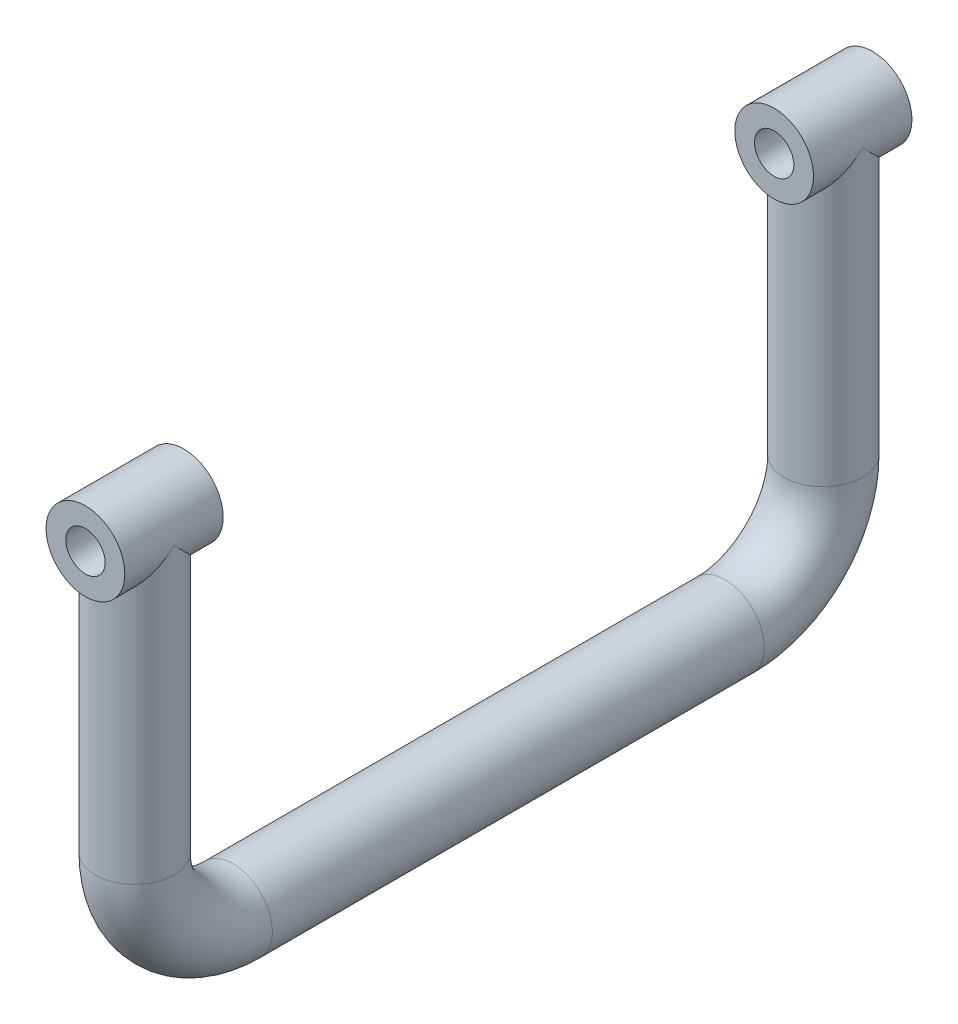
ISO-10303-21;
HEADER;
FILE_DESCRIPTION(('STEP AP214'),'2;1');
FILE_NAME('part.step','',(''),(''),'','','');
FILE_SCHEMA(('AUTOMOTIVE_DESIGN { 1 0 10303 214 1 1 1 1 }'));
ENDSEC;
DATA;
#1=APPLICATION_CONTEXT('core data for automotive mechanical design processes');
#2=APPLICATION_PROTOCOL_DEFINITION('international standard','automotive_design',2000,#1);
#3=PRODUCT_CONTEXT('',#1,'mechanical');
#4=PRODUCT('Part','Part','',(#3));
#5=PRODUCT_RELATED_PRODUCT_CATEGORY('part','',(#4));
#6=PRODUCT_DEFINITION_FORMATION('','',#4);
#7=PRODUCT_DEFINITION_CONTEXT('part definition',#1,'design');
#8=PRODUCT_DEFINITION('design','',#6,#7);
#9=PRODUCT_DEFINITION_SHAPE('','',#8);
#10=(LENGTH_UNIT() NAMED_UNIT(*) SI_UNIT(.MILLI.,.METRE.));
#11=(NAMED_UNIT(*) PLANE_ANGLE_UNIT() SI_UNIT($,.RADIAN.));
#12=(NAMED_UNIT(*) SI_UNIT($,.STERADIAN.) SOLID_ANGLE_UNIT());
#13=UNCERTAINTY_MEASURE_WITH_UNIT(LENGTH_MEASURE(1.E-05),#10,'distance_accuracy_value','');
#14=(GEOMETRIC_REPRESENTATION_CONTEXT(3) GLOBAL_UNCERTAINTY_ASSIGNED_CONTEXT((#13)) GLOBAL_UNIT_ASSIGNED_CONTEXT((#10,
#11,#12)) REPRESENTATION_CONTEXT('',''));
#15=CARTESIAN_POINT('',(0.,0.,0.));
#16=DIRECTION('',(0.,0.,1.));
#17=DIRECTION('',(1.,0.,0.));
#18=AXIS2_PLACEMENT_3D('',#15,#16,#17);
#19=CARTESIAN_POINT('',(0.,0.,5.));
#20=DIRECTION('',(0.,0.,1.));
#21=DIRECTION('',(1.,0.,0.));
#22=AXIS2_PLACEMENT_3D('',#19,#20,#21);
#23=PLANE('',#22);
#24=CARTESIAN_POINT('',(0.,0.,5.));
#25=DIRECTION('',(0.,0.,1.));
#26=DIRECTION('',(1.,0.,0.));
#27=AXIS2_PLACEMENT_3D('',#24,#25,#26);
#28=CIRCLE('',#27,2.);
#29=CARTESIAN_POINT('',(2.,0.,5.));
#30=VERTEX_POINT('',#29);
#31=EDGE_CURVE('E11',#30,#30,#28,.T.);
#32=ORIENTED_EDGE('',*,*,#31,.T.);
#33=EDGE_LOOP('',(#32));
#34=FACE_BOUND('',#33,.T.);
#35=CARTESIAN_POINT('',(0.,0.,5.));
#36=DIRECTION('',(0.,0.,1.));
#37=DIRECTION('',(1.,0.,0.));
#38=AXIS2_PLACEMENT_3D('',#35,#36,#37);
#39=CIRCLE('',#38,1.);
#40=CARTESIAN_POINT('',(1.,0.,5.));
#41=VERTEX_POINT('',#40);
#42=EDGE_CURVE('E100',#41,#41,#39,.T.);
#43=ORIENTED_EDGE('',*,*,#42,.F.);
#44=EDGE_LOOP('',(#43));
#45=FACE_BOUND('',#44,.T.);
#46=ADVANCED_FACE('F39',(#34,#45),#23,.T.);
#47=CARTESIAN_POINT('',(0.,0.,0.));
#48=DIRECTION('',(0.,0.,1.));
#49=DIRECTION('',(1.,0.,0.));
#50=AXIS2_PLACEMENT_3D('',#47,#48,#49);
#51=PLANE('',#50);
#52=CARTESIAN_POINT('',(0.,0.,0.));
#53=DIRECTION('',(0.,0.,1.));
#54=DIRECTION('',(1.,0.,0.));
#55=AXIS2_PLACEMENT_3D('',#52,#53,#54);
#56=CIRCLE('',#55,2.);
#57=CARTESIAN_POINT('',(2.,0.,0.));
#58=VERTEX_POINT('',#57);
#59=EDGE_CURVE('E43',#58,#58,#56,.T.);
#60=ORIENTED_EDGE('',*,*,#59,.F.);
#61=EDGE_LOOP('',(#60));
#62=FACE_BOUND('',#61,.T.);
#63=CARTESIAN_POINT('',(0.,0.,0.));
#64=DIRECTION('',(0.,0.,1.));
#65=DIRECTION('',(1.,0.,0.));
#66=AXIS2_PLACEMENT_3D('',#63,#64,#65);
#67=CIRCLE('',#66,1.);
#68=CARTESIAN_POINT('',(1.,0.,0.));
#69=VERTEX_POINT('',#68);
#70=EDGE_CURVE('E91',#69,#69,#67,.T.);
#71=ORIENTED_EDGE('',*,*,#70,.T.);
#72=EDGE_LOOP('',(#71));
#73=FACE_BOUND('',#72,.T.);
#74=ADVANCED_FACE('F108',(#62,#73),#51,.F.);
#75=CARTESIAN_POINT('',(0.,0.,5.));
#76=DIRECTION('',(0.,0.,-1.));
#77=DIRECTION('',(-1.,0.,0.));
#78=AXIS2_PLACEMENT_3D('',#75,#76,#77);
#79=CYLINDRICAL_SURFACE('',#78,2.);
#80=CARTESIAN_POINT('',(0.,0.,2.5));
#81=DIRECTION('',(0.,-0.707106781186548,0.707106781186547));
#82=DIRECTION('',(0.,-0.707106781186547,-0.707106781186547));
#83=AXIS2_PLACEMENT_3D('',#80,#81,#82);
#84=ELLIPSE('',#83,2.82842712474619,2.);
#85=CARTESIAN_POINT('',(-2.,0.,2.5));
#86=VERTEX_POINT('',#85);
#87=CARTESIAN_POINT('',(2.,0.,2.5));
#88=VERTEX_POINT('',#87);
#89=EDGE_CURVE('E58',#86,#88,#84,.T.);
#90=ORIENTED_EDGE('',*,*,#89,.F.);
#91=CARTESIAN_POINT('',(0.,0.,2.5));
#92=DIRECTION('',(0.,-0.707106781186547,-0.707106781186547));
#93=DIRECTION('',(0.,-0.707106781186548,0.707106781186547));
#94=AXIS2_PLACEMENT_3D('',#91,#92,#93);
#95=ELLIPSE('',#94,2.82842712474619,2.);
#96=EDGE_CURVE('E54',#88,#86,#95,.T.);
#97=ORIENTED_EDGE('',*,*,#96,.F.);
#98=EDGE_LOOP('',(#90,#97));
#99=FACE_BOUND('',#98,.T.);
#100=ORIENTED_EDGE('',*,*,#31,.F.);
#101=EDGE_LOOP('',(#100));
#102=FACE_BOUND('',#101,.T.);
#103=ORIENTED_EDGE('',*,*,#59,.T.);
#104=EDGE_LOOP('',(#103));
#105=FACE_BOUND('',#104,.T.);
#106=ADVANCED_FACE('F41',(#99,#102,#105),#79,.T.);
#107=CARTESIAN_POINT('',(0.,0.,5.));
#108=DIRECTION('',(0.,0.,-1.));
#109=DIRECTION('',(-1.,0.,0.));
#110=AXIS2_PLACEMENT_3D('',#107,#108,#109);
#111=CYLINDRICAL_SURFACE('',#110,1.);
#112=ORIENTED_EDGE('',*,*,#42,.T.);
#113=EDGE_LOOP('',(#112));
#114=FACE_BOUND('',#113,.T.);
#115=ORIENTED_EDGE('',*,*,#70,.F.);
#116=EDGE_LOOP('',(#115));
#117=FACE_BOUND('',#116,.T.);
#118=ADVANCED_FACE('F110',(#114,#117),#111,.F.);
#119=CARTESIAN_POINT('',(0.,3.,2.5));
#120=DIRECTION('',(0.,-1.,0.));
#121=DIRECTION('',(0.,0.,-1.));
#122=AXIS2_PLACEMENT_3D('',#119,#120,#121);
#123=CYLINDRICAL_SURFACE('',#122,2.);
#124=CARTESIAN_POINT('',(0.,-14.5,2.5));
#125=DIRECTION('',(0.,-1.,0.));
#126=DIRECTION('',(-1.,0.,0.));
#127=AXIS2_PLACEMENT_3D('',#124,#125,#126);
#128=CIRCLE('',#127,2.);
#129=CARTESIAN_POINT('',(0.,-14.5,4.5));
#130=VERTEX_POINT('',#129);
#131=EDGE_CURVE('E76',#130,#130,#128,.T.);
#132=ORIENTED_EDGE('',*,*,#131,.F.);
#133=EDGE_LOOP('',(#132));
#134=FACE_BOUND('',#133,.T.);
#135=ORIENTED_EDGE('',*,*,#89,.T.);
#136=ORIENTED_EDGE('',*,*,#96,.T.);
#137=EDGE_LOOP('',(#135,#136));
#138=FACE_BOUND('',#137,.T.);
#139=ADVANCED_FACE('F112',(#134,#138),#123,.T.);
#140=CARTESIAN_POINT('',(0.,-14.5,-32.5));
#141=DIRECTION('',(0.,1.,0.));
#142=DIRECTION('',(0.,0.,1.));
#143=AXIS2_PLACEMENT_3D('',#140,#141,#142);
#144=CYLINDRICAL_SURFACE('',#143,2.);
#145=CARTESIAN_POINT('',(0.,-14.5,-32.5));
#146=DIRECTION('',(0.,1.,0.));
#147=DIRECTION('',(-1.,0.,0.));
#148=AXIS2_PLACEMENT_3D('',#145,#146,#147);
#149=CIRCLE('',#148,2.);
#150=CARTESIAN_POINT('',(0.,-14.5,-34.5));
#151=VERTEX_POINT('',#150);
#152=EDGE_CURVE('E72',#151,#151,#149,.T.);
#153=ORIENTED_EDGE('',*,*,#152,.T.);
#154=EDGE_LOOP('',(#153));
#155=FACE_BOUND('',#154,.T.);
#156=CARTESIAN_POINT('',(0.,0.,-32.5));
#157=DIRECTION('',(0.,0.707106781186547,-0.707106781186547));
#158=DIRECTION('',(0.,0.707106781186547,0.707106781186547));
#159=AXIS2_PLACEMENT_3D('',#156,#157,#158);
#160=ELLIPSE('',#159,2.82842712474619,2.);
#161=CARTESIAN_POINT('',(-2.,0.,-32.5));
#162=VERTEX_POINT('',#161);
#163=CARTESIAN_POINT('',(2.,0.,-32.5));
#164=VERTEX_POINT('',#163);
#165=EDGE_CURVE('E65',#162,#164,#160,.F.);
#166=ORIENTED_EDGE('',*,*,#165,.T.);
#167=CARTESIAN_POINT('',(0.,0.,-32.5));
#168=DIRECTION('',(0.,0.707106781186547,0.707106781186547));
#169=DIRECTION('',(0.,0.707106781186547,-0.707106781186547));
#170=AXIS2_PLACEMENT_3D('',#167,#168,#169);
#171=ELLIPSE('',#170,2.82842712474619,2.);
#172=EDGE_CURVE('E69',#164,#162,#171,.F.);
#173=ORIENTED_EDGE('',*,*,#172,.T.);
#174=EDGE_LOOP('',(#166,#173));
#175=FACE_BOUND('',#174,.T.);
#176=ADVANCED_FACE('F74',(#155,#175),#144,.T.);
#177=CARTESIAN_POINT('',(0.,-14.5,-2.5));
#178=DIRECTION('',(1.,0.,0.));
#179=DIRECTION('',(0.,0.,-1.));
#180=AXIS2_PLACEMENT_3D('',#177,#178,#179);
#181=TOROIDAL_SURFACE('',#180,5.,2.);
#182=CARTESIAN_POINT('',(0.,-19.5,-2.5));
#183=DIRECTION('',(0.,0.,-1.));
#184=DIRECTION('',(-1.,0.,0.));
#185=AXIS2_PLACEMENT_3D('',#182,#183,#184);
#186=CIRCLE('',#185,2.);
#187=CARTESIAN_POINT('',(0.,-21.5,-2.5));
#188=VERTEX_POINT('',#187);
#189=EDGE_CURVE('E80',#188,#188,#186,.T.);
#190=CARTESIAN_POINT('',(0.,-14.5,-2.5));
#191=DIRECTION('',(1.,0.,0.));
#192=DIRECTION('',(0.,0.,-1.));
#193=AXIS2_PLACEMENT_3D('',#190,#191,#192);
#194=CIRCLE('',#193,7.);
#195=EDGE_CURVE('',#130,#188,#194,.T.);
#196=ORIENTED_EDGE('',*,*,#131,.T.);
#197=ORIENTED_EDGE('',*,*,#189,.F.);
#198=ORIENTED_EDGE('',*,*,#195,.T.);
#199=ORIENTED_EDGE('',*,*,#195,.F.);
#200=EDGE_LOOP('',(#196,#198,#197,#199));
#201=FACE_BOUND('',#200,.T.);
#202=ADVANCED_FACE('F161',(#201),#181,.T.);
#203=CARTESIAN_POINT('',(0.,-19.5,-2.5));
#204=DIRECTION('',(0.,0.,-1.));
#205=DIRECTION('',(0.,1.,0.));
#206=AXIS2_PLACEMENT_3D('',#203,#204,#205);
#207=CYLINDRICAL_SURFACE('',#206,2.);
#208=CARTESIAN_POINT('',(0.,-19.5,-27.5));
#209=DIRECTION('',(0.,0.,-1.));
#210=DIRECTION('',(-1.,0.,0.));
#211=AXIS2_PLACEMENT_3D('',#208,#209,#210);
#212=CIRCLE('',#211,2.);
#213=CARTESIAN_POINT('',(0.,-21.5,-27.5));
#214=VERTEX_POINT('',#213);
#215=EDGE_CURVE('E87',#214,#214,#212,.T.);
#216=ORIENTED_EDGE('',*,*,#215,.F.);
#217=EDGE_LOOP('',(#216));
#218=FACE_BOUND('',#217,.T.);
#219=ORIENTED_EDGE('',*,*,#189,.T.);
#220=EDGE_LOOP('',(#219));
#221=FACE_BOUND('',#220,.T.);
#222=ADVANCED_FACE('F172',(#218,#221),#207,.T.);
#223=CARTESIAN_POINT('',(0.,-14.5,-27.5));
#224=DIRECTION('',(1.,0.,0.));
#225=DIRECTION('',(0.,0.,-1.));
#226=AXIS2_PLACEMENT_3D('',#223,#224,#225);
#227=TOROIDAL_SURFACE('',#226,5.00000000000001,2.);
#228=CARTESIAN_POINT('',(0.,-14.5,-27.5));
#229=DIRECTION('',(1.,0.,0.));
#230=DIRECTION('',(0.,0.,-1.));
#231=AXIS2_PLACEMENT_3D('',#228,#229,#230);
#232=CIRCLE('',#231,7.00000000000001);
#233=EDGE_CURVE('',#214,#151,#232,.T.);
#234=ORIENTED_EDGE('',*,*,#215,.T.);
#235=ORIENTED_EDGE('',*,*,#152,.F.);
#236=ORIENTED_EDGE('',*,*,#233,.T.);
#237=ORIENTED_EDGE('',*,*,#233,.F.);
#238=EDGE_LOOP('',(#234,#236,#235,#237));
#239=FACE_BOUND('',#238,.T.);
#240=ADVANCED_FACE('F164',(#239),#227,.T.);
#241=CARTESIAN_POINT('',(0.,0.,-35.));
#242=DIRECTION('',(0.,0.,-1.));
#243=DIRECTION('',(-1.,0.,0.));
#244=AXIS2_PLACEMENT_3D('',#241,#242,#243);
#245=PLANE('',#244);
#246=CARTESIAN_POINT('',(0.,0.,-35.));
#247=DIRECTION('',(0.,0.,-1.));
#248=DIRECTION('',(-1.,0.,0.));
#249=AXIS2_PLACEMENT_3D('',#246,#247,#248);
#250=CIRCLE('',#249,2.);
#251=CARTESIAN_POINT('',(-2.,0.,-35.));
#252=VERTEX_POINT('',#251);
#253=EDGE_CURVE('E99',#252,#252,#250,.T.);
#254=ORIENTED_EDGE('',*,*,#253,.T.);
#255=EDGE_LOOP('',(#254));
#256=FACE_BOUND('',#255,.T.);
#257=CARTESIAN_POINT('',(0.,0.,-35.));
#258=DIRECTION('',(0.,0.,-1.));
#259=DIRECTION('',(-1.,0.,0.));
#260=AXIS2_PLACEMENT_3D('',#257,#258,#259);
#261=CIRCLE('',#260,1.);
#262=CARTESIAN_POINT('',(-1.,0.,-35.));
#263=VERTEX_POINT('',#262);
#264=EDGE_CURVE('E235',#263,#263,#261,.T.);
#265=ORIENTED_EDGE('',*,*,#264,.F.);
#266=EDGE_LOOP('',(#265));
#267=FACE_BOUND('',#266,.T.);
#268=ADVANCED_FACE('F175',(#256,#267),#245,.T.);
#269=CARTESIAN_POINT('',(0.,0.,-30.));
#270=DIRECTION('',(0.,0.,-1.));
#271=DIRECTION('',(-1.,0.,0.));
#272=AXIS2_PLACEMENT_3D('',#269,#270,#271);
#273=PLANE('',#272);
#274=CARTESIAN_POINT('',(0.,0.,-30.));
#275=DIRECTION('',(0.,0.,-1.));
#276=DIRECTION('',(-1.,0.,0.));
#277=AXIS2_PLACEMENT_3D('',#274,#275,#276);
#278=CIRCLE('',#277,2.);
#279=CARTESIAN_POINT('',(-2.,0.,-30.));
#280=VERTEX_POINT('',#279);
#281=EDGE_CURVE('E243',#280,#280,#278,.T.);
#282=ORIENTED_EDGE('',*,*,#281,.F.);
#283=EDGE_LOOP('',(#282));
#284=FACE_BOUND('',#283,.T.);
#285=CARTESIAN_POINT('',(0.,0.,-30.));
#286=DIRECTION('',(0.,0.,-1.));
#287=DIRECTION('',(-1.,0.,0.));
#288=AXIS2_PLACEMENT_3D('',#285,#286,#287);
#289=CIRCLE('',#288,1.);
#290=CARTESIAN_POINT('',(-1.,0.,-30.));
#291=VERTEX_POINT('',#290);
#292=EDGE_CURVE('E238',#291,#291,#289,.T.);
#293=ORIENTED_EDGE('',*,*,#292,.T.);
#294=EDGE_LOOP('',(#293));
#295=FACE_BOUND('',#294,.T.);
#296=ADVANCED_FACE('F201',(#284,#295),#273,.F.);
#297=CARTESIAN_POINT('',(0.,0.,-35.));
#298=DIRECTION('',(0.,0.,1.));
#299=DIRECTION('',(1.,0.,0.));
#300=AXIS2_PLACEMENT_3D('',#297,#298,#299);
#301=CYLINDRICAL_SURFACE('',#300,2.);
#302=ORIENTED_EDGE('',*,*,#172,.F.);
#303=ORIENTED_EDGE('',*,*,#165,.F.);
#304=EDGE_LOOP('',(#302,#303));
#305=FACE_BOUND('',#304,.T.);
#306=ORIENTED_EDGE('',*,*,#253,.F.);
#307=EDGE_LOOP('',(#306));
#308=FACE_BOUND('',#307,.T.);
#309=ORIENTED_EDGE('',*,*,#281,.T.);
#310=EDGE_LOOP('',(#309));
#311=FACE_BOUND('',#310,.T.);
#312=ADVANCED_FACE('F67',(#305,#308,#311),#301,.T.);
#313=CARTESIAN_POINT('',(0.,0.,-35.));
#314=DIRECTION('',(0.,0.,1.));
#315=DIRECTION('',(1.,0.,0.));
#316=AXIS2_PLACEMENT_3D('',#313,#314,#315);
#317=CYLINDRICAL_SURFACE('',#316,1.);
#318=ORIENTED_EDGE('',*,*,#264,.T.);
#319=EDGE_LOOP('',(#318));
#320=FACE_BOUND('',#319,.T.);
#321=ORIENTED_EDGE('',*,*,#292,.F.);
#322=EDGE_LOOP('',(#321));
#323=FACE_BOUND('',#322,.T.);
#324=ADVANCED_FACE('F220',(#320,#323),#317,.F.);
#325=CLOSED_SHELL('',(#46,#74,#106,#118,#139,#176,#202,#222,#240,#268,#296,#312,#324));
#326=MANIFOLD_SOLID_BREP('B2',#325);
#327=ADVANCED_BREP_SHAPE_REPRESENTATION('',(#18,#326),#14);
#328=SHAPE_DEFINITION_REPRESENTATION(#9,#327);
ENDSEC;
END-ISO-10303-21;
